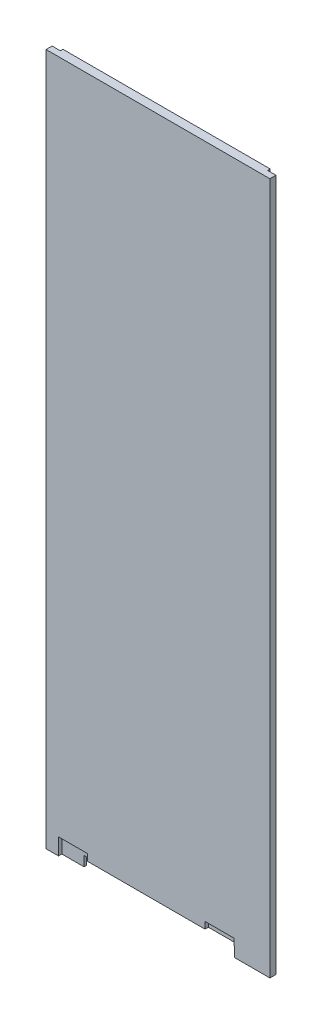
ISO-10303-21;
HEADER;
FILE_DESCRIPTION(('STEP AP214'),'2;1');
FILE_NAME('part.step','',(''),(''),'','','');
FILE_SCHEMA(('AUTOMOTIVE_DESIGN { 1 0 10303 214 1 1 1 1 }'));
ENDSEC;
DATA;
#1=APPLICATION_CONTEXT('core data for automotive mechanical design processes');
#2=APPLICATION_PROTOCOL_DEFINITION('international standard','automotive_design',2000,#1);
#3=PRODUCT_CONTEXT('',#1,'mechanical');
#4=PRODUCT('Part','Part','',(#3));
#5=PRODUCT_RELATED_PRODUCT_CATEGORY('part','',(#4));
#6=PRODUCT_DEFINITION_FORMATION('','',#4);
#7=PRODUCT_DEFINITION_CONTEXT('part definition',#1,'design');
#8=PRODUCT_DEFINITION('design','',#6,#7);
#9=PRODUCT_DEFINITION_SHAPE('','',#8);
#10=(LENGTH_UNIT() NAMED_UNIT(*) SI_UNIT(.MILLI.,.METRE.));
#11=(NAMED_UNIT(*) PLANE_ANGLE_UNIT() SI_UNIT($,.RADIAN.));
#12=(NAMED_UNIT(*) SI_UNIT($,.STERADIAN.) SOLID_ANGLE_UNIT());
#13=UNCERTAINTY_MEASURE_WITH_UNIT(LENGTH_MEASURE(1.E-05),#10,'distance_accuracy_value','');
#14=(GEOMETRIC_REPRESENTATION_CONTEXT(3) GLOBAL_UNCERTAINTY_ASSIGNED_CONTEXT((#13)) GLOBAL_UNIT_ASSIGNED_CONTEXT((#10,
#11,#12)) REPRESENTATION_CONTEXT('',''));
#15=CARTESIAN_POINT('',(0.,0.,0.));
#16=DIRECTION('',(0.,0.,1.));
#17=DIRECTION('',(1.,0.,0.));
#18=AXIS2_PLACEMENT_3D('',#15,#16,#17);
#19=CARTESIAN_POINT('',(54.,-167.,2.921));
#20=DIRECTION('',(0.,1.,0.));
#21=DIRECTION('',(0.,0.,1.));
#22=AXIS2_PLACEMENT_3D('',#19,#20,#21);
#23=PLANE('',#22);
#24=DIRECTION('',(1.,0.,0.));
#25=VECTOR('',#24,1.);
#26=CARTESIAN_POINT('',(-48.,-167.,1.31280493339982));
#27=LINE('',#26,#25);
#28=CARTESIAN_POINT('',(-48.,-167.,1.31280493339982));
#29=VERTEX_POINT('',#28);
#30=CARTESIAN_POINT('',(-37.32,-167.,1.31280493339982));
#31=VERTEX_POINT('',#30);
#32=EDGE_CURVE('E230',#29,#31,#27,.T.);
#33=ORIENTED_EDGE('',*,*,#32,.F.);
#34=DIRECTION('',(0.,0.,-1.));
#35=VECTOR('',#34,1.);
#36=CARTESIAN_POINT('',(-48.,-167.,2.921));
#37=LINE('',#36,#35);
#38=CARTESIAN_POINT('',(-48.,-167.,2.921));
#39=VERTEX_POINT('',#38);
#40=EDGE_CURVE('E240',#39,#29,#37,.T.);
#41=ORIENTED_EDGE('',*,*,#40,.F.);
#42=DIRECTION('',(1.,0.,0.));
#43=VECTOR('',#42,1.);
#44=CARTESIAN_POINT('',(54.,-167.,2.921));
#45=LINE('',#44,#43);
#46=CARTESIAN_POINT('',(-54.,-167.,2.921));
#47=VERTEX_POINT('',#46);
#48=EDGE_CURVE('E285',#47,#39,#45,.T.);
#49=ORIENTED_EDGE('',*,*,#48,.F.);
#50=DIRECTION('',(0.,0.,-1.));
#51=VECTOR('',#50,1.);
#52=CARTESIAN_POINT('',(-54.,-167.,2.921));
#53=LINE('',#52,#51);
#54=CARTESIAN_POINT('',(-54.,-167.,0.));
#55=VERTEX_POINT('',#54);
#56=EDGE_CURVE('E311',#47,#55,#53,.T.);
#57=ORIENTED_EDGE('',*,*,#56,.T.);
#58=DIRECTION('',(1.,0.,0.));
#59=VECTOR('',#58,1.);
#60=CARTESIAN_POINT('',(54.,-167.,0.));
#61=LINE('',#60,#59);
#62=CARTESIAN_POINT('',(-37.32,-167.,0.));
#63=VERTEX_POINT('',#62);
#64=EDGE_CURVE('E296',#55,#63,#61,.T.);
#65=ORIENTED_EDGE('',*,*,#64,.T.);
#66=DIRECTION('',(0.,0.,1.));
#67=VECTOR('',#66,1.);
#68=CARTESIAN_POINT('',(-37.32,-167.,0.));
#69=LINE('',#68,#67);
#70=EDGE_CURVE('E264',#63,#31,#69,.T.);
#71=ORIENTED_EDGE('',*,*,#70,.T.);
#72=EDGE_LOOP('',(#33,#41,#49,#57,#65,#71));
#73=FACE_BOUND('',#72,.T.);
#74=ADVANCED_FACE('F33',(#73),#23,.F.);
#75=CARTESIAN_POINT('',(-54.,167.,2.921));
#76=DIRECTION('',(1.,0.,0.));
#77=DIRECTION('',(0.,1.,0.));
#78=AXIS2_PLACEMENT_3D('',#75,#76,#77);
#79=PLANE('',#78);
#80=DIRECTION('',(0.,-1.,0.));
#81=VECTOR('',#80,1.);
#82=CARTESIAN_POINT('',(-54.,167.,0.));
#83=LINE('',#82,#81);
#84=CARTESIAN_POINT('',(-54.,167.,0.));
#85=VERTEX_POINT('',#84);
#86=EDGE_CURVE('E273',#85,#55,#83,.T.);
#87=ORIENTED_EDGE('',*,*,#86,.T.);
#88=ORIENTED_EDGE('',*,*,#56,.F.);
#89=DIRECTION('',(0.,-1.,0.));
#90=VECTOR('',#89,1.);
#91=CARTESIAN_POINT('',(-54.,167.,2.921));
#92=LINE('',#91,#90);
#93=CARTESIAN_POINT('',(-54.,167.,2.921));
#94=VERTEX_POINT('',#93);
#95=EDGE_CURVE('E280',#94,#47,#92,.T.);
#96=ORIENTED_EDGE('',*,*,#95,.F.);
#97=DIRECTION('',(0.,0.,-1.));
#98=VECTOR('',#97,1.);
#99=CARTESIAN_POINT('',(-54.,167.,2.921));
#100=LINE('',#99,#98);
#101=EDGE_CURVE('E292',#94,#85,#100,.T.);
#102=ORIENTED_EDGE('',*,*,#101,.T.);
#103=EDGE_LOOP('',(#87,#88,#96,#102));
#104=FACE_BOUND('',#103,.T.);
#105=ADVANCED_FACE('F35',(#104),#79,.F.);
#106=CARTESIAN_POINT('',(36.88,-167.,2.921));
#107=VERTEX_POINT('',#106);
#108=CARTESIAN_POINT('',(54.,-167.,2.921));
#109=VERTEX_POINT('',#108);
#110=EDGE_CURVE('E283',#107,#109,#45,.T.);
#111=ORIENTED_EDGE('',*,*,#110,.F.);
#112=DIRECTION('',(0.,0.,1.));
#113=VECTOR('',#112,1.);
#114=CARTESIAN_POINT('',(36.88,-167.,0.));
#115=LINE('',#114,#113);
#116=CARTESIAN_POINT('',(36.88,-167.,0.));
#117=VERTEX_POINT('',#116);
#118=EDGE_CURVE('E276',#117,#107,#115,.T.);
#119=ORIENTED_EDGE('',*,*,#118,.F.);
#120=CARTESIAN_POINT('',(54.,-167.,0.));
#121=VERTEX_POINT('',#120);
#122=EDGE_CURVE('E295',#117,#121,#61,.T.);
#123=ORIENTED_EDGE('',*,*,#122,.T.);
#124=DIRECTION('',(0.,0.,-1.));
#125=VECTOR('',#124,1.);
#126=CARTESIAN_POINT('',(54.,-167.,2.921));
#127=LINE('',#126,#125);
#128=EDGE_CURVE('E308',#109,#121,#127,.T.);
#129=ORIENTED_EDGE('',*,*,#128,.F.);
#130=EDGE_LOOP('',(#111,#119,#123,#129));
#131=FACE_BOUND('',#130,.T.);
#132=ADVANCED_FACE('F369',(#131),#23,.F.);
#133=CARTESIAN_POINT('',(54.,167.,2.921));
#134=DIRECTION('',(-1.,0.,0.));
#135=DIRECTION('',(0.,-1.,0.));
#136=AXIS2_PLACEMENT_3D('',#133,#134,#135);
#137=PLANE('',#136);
#138=DIRECTION('',(0.,1.,0.));
#139=VECTOR('',#138,1.);
#140=CARTESIAN_POINT('',(54.,167.,0.));
#141=LINE('',#140,#139);
#142=CARTESIAN_POINT('',(54.,167.,0.));
#143=VERTEX_POINT('',#142);
#144=EDGE_CURVE('E299',#121,#143,#141,.T.);
#145=ORIENTED_EDGE('',*,*,#144,.T.);
#146=DIRECTION('',(0.,0.,-1.));
#147=VECTOR('',#146,1.);
#148=CARTESIAN_POINT('',(54.,167.,2.921));
#149=LINE('',#148,#147);
#150=CARTESIAN_POINT('',(54.,167.,2.921));
#151=VERTEX_POINT('',#150);
#152=EDGE_CURVE('E305',#151,#143,#149,.T.);
#153=ORIENTED_EDGE('',*,*,#152,.F.);
#154=DIRECTION('',(0.,1.,0.));
#155=VECTOR('',#154,1.);
#156=CARTESIAN_POINT('',(54.,167.,2.921));
#157=LINE('',#156,#155);
#158=EDGE_CURVE('E288',#109,#151,#157,.T.);
#159=ORIENTED_EDGE('',*,*,#158,.F.);
#160=ORIENTED_EDGE('',*,*,#128,.T.);
#161=EDGE_LOOP('',(#145,#153,#159,#160));
#162=FACE_BOUND('',#161,.T.);
#163=ADVANCED_FACE('F372',(#162),#137,.F.);
#164=CARTESIAN_POINT('',(54.,167.,2.921));
#165=DIRECTION('',(0.,-1.,0.));
#166=DIRECTION('',(0.,0.,-1.));
#167=AXIS2_PLACEMENT_3D('',#164,#165,#166);
#168=PLANE('',#167);
#169=DIRECTION('',(-1.,0.,0.));
#170=VECTOR('',#169,1.);
#171=CARTESIAN_POINT('',(54.,167.,0.));
#172=LINE('',#171,#170);
#173=CARTESIAN_POINT('',(50.,167.,0.));
#174=VERTEX_POINT('',#173);
#175=EDGE_CURVE('E284',#143,#174,#172,.T.);
#176=ORIENTED_EDGE('',*,*,#175,.T.);
#177=DIRECTION('',(0.,0.,-1.));
#178=VECTOR('',#177,1.);
#179=CARTESIAN_POINT('',(50.,167.,0.));
#180=LINE('',#179,#178);
#181=CARTESIAN_POINT('',(50.,167.,-1.25));
#182=VERTEX_POINT('',#181);
#183=EDGE_CURVE('E48',#174,#182,#180,.T.);
#184=ORIENTED_EDGE('',*,*,#183,.T.);
#185=DIRECTION('',(-1.,0.,0.));
#186=VECTOR('',#185,1.);
#187=CARTESIAN_POINT('',(-50.,167.,-1.25));
#188=LINE('',#187,#186);
#189=CARTESIAN_POINT('',(-50.,167.,-1.25));
#190=VERTEX_POINT('',#189);
#191=EDGE_CURVE('E188',#182,#190,#188,.T.);
#192=ORIENTED_EDGE('',*,*,#191,.T.);
#193=DIRECTION('',(0.,0.,1.));
#194=VECTOR('',#193,1.);
#195=CARTESIAN_POINT('',(-50.,167.,0.));
#196=LINE('',#195,#194);
#197=CARTESIAN_POINT('',(-50.,167.,0.));
#198=VERTEX_POINT('',#197);
#199=EDGE_CURVE('E563',#190,#198,#196,.T.);
#200=ORIENTED_EDGE('',*,*,#199,.T.);
#201=EDGE_CURVE('E193',#198,#85,#172,.T.);
#202=ORIENTED_EDGE('',*,*,#201,.T.);
#203=ORIENTED_EDGE('',*,*,#101,.F.);
#204=DIRECTION('',(-1.,0.,0.));
#205=VECTOR('',#204,1.);
#206=CARTESIAN_POINT('',(54.,167.,2.921));
#207=LINE('',#206,#205);
#208=EDGE_CURVE('E290',#151,#94,#207,.T.);
#209=ORIENTED_EDGE('',*,*,#208,.F.);
#210=ORIENTED_EDGE('',*,*,#152,.T.);
#211=EDGE_LOOP('',(#176,#184,#192,#200,#202,#203,#209,#210));
#212=FACE_BOUND('',#211,.T.);
#213=ADVANCED_FACE('F379',(#212),#168,.F.);
#214=CARTESIAN_POINT('',(0.,0.,2.921));
#215=DIRECTION('',(0.,0.,-1.));
#216=DIRECTION('',(-1.,0.,0.));
#217=AXIS2_PLACEMENT_3D('',#214,#215,#216);
#218=PLANE('',#217);
#219=DIRECTION('',(-1.,0.,0.));
#220=VECTOR('',#219,1.);
#221=CARTESIAN_POINT('',(36.6829971722449,-159.,2.921));
#222=LINE('',#221,#220);
#223=CARTESIAN_POINT('',(36.6829971722449,-159.,2.921));
#224=VERTEX_POINT('',#223);
#225=CARTESIAN_POINT('',(22.6829971722449,-159.,2.921));
#226=VERTEX_POINT('',#225);
#227=EDGE_CURVE('E205',#224,#226,#222,.T.);
#228=ORIENTED_EDGE('',*,*,#227,.F.);
#229=DIRECTION('',(0.,-1.,0.));
#230=VECTOR('',#229,1.);
#231=CARTESIAN_POINT('',(36.6829971722449,-159.,2.921));
#232=LINE('',#231,#230);
#233=CARTESIAN_POINT('',(36.6829971722449,-162.24924483,2.921));
#234=VERTEX_POINT('',#233);
#235=EDGE_CURVE('E215',#224,#234,#232,.T.);
#236=ORIENTED_EDGE('',*,*,#235,.T.);
#237=DIRECTION('',(-1.,0.,0.));
#238=VECTOR('',#237,1.);
#239=CARTESIAN_POINT('',(-37.32,-162.24924483,2.921));
#240=LINE('',#239,#238);
#241=CARTESIAN_POINT('',(36.88,-162.24924483,2.921));
#242=VERTEX_POINT('',#241);
#243=EDGE_CURVE('E258',#242,#234,#240,.T.);
#244=ORIENTED_EDGE('',*,*,#243,.F.);
#245=DIRECTION('',(0.,1.,0.));
#246=VECTOR('',#245,1.);
#247=CARTESIAN_POINT('',(36.88,-167.,2.921));
#248=LINE('',#247,#246);
#249=EDGE_CURVE('E253',#107,#242,#248,.T.);
#250=ORIENTED_EDGE('',*,*,#249,.F.);
#251=ORIENTED_EDGE('',*,*,#110,.T.);
#252=ORIENTED_EDGE('',*,*,#158,.T.);
#253=ORIENTED_EDGE('',*,*,#208,.T.);
#254=ORIENTED_EDGE('',*,*,#95,.T.);
#255=ORIENTED_EDGE('',*,*,#48,.T.);
#256=DIRECTION('',(0.,-1.,0.));
#257=VECTOR('',#256,1.);
#258=CARTESIAN_POINT('',(-48.,-159.,2.921));
#259=LINE('',#258,#257);
#260=CARTESIAN_POINT('',(-48.,-159.,2.921));
#261=VERTEX_POINT('',#260);
#262=EDGE_CURVE('E206',#261,#39,#259,.T.);
#263=ORIENTED_EDGE('',*,*,#262,.F.);
#264=DIRECTION('',(-1.,0.,0.));
#265=VECTOR('',#264,1.);
#266=CARTESIAN_POINT('',(-48.,-159.,2.921));
#267=LINE('',#266,#265);
#268=CARTESIAN_POINT('',(-34.,-159.,2.921));
#269=VERTEX_POINT('',#268);
#270=EDGE_CURVE('E236',#269,#261,#267,.T.);
#271=ORIENTED_EDGE('',*,*,#270,.F.);
#272=DIRECTION('',(0.,-1.,0.));
#273=VECTOR('',#272,1.);
#274=CARTESIAN_POINT('',(-34.,-159.,2.921));
#275=LINE('',#274,#273);
#276=CARTESIAN_POINT('',(-34.,-162.24924483,2.921));
#277=VERTEX_POINT('',#276);
#278=EDGE_CURVE('E245',#269,#277,#275,.T.);
#279=ORIENTED_EDGE('',*,*,#278,.T.);
#280=CARTESIAN_POINT('',(22.6829971722449,-162.24924483,2.921));
#281=VERTEX_POINT('',#280);
#282=EDGE_CURVE('E267',#281,#277,#240,.T.);
#283=ORIENTED_EDGE('',*,*,#282,.F.);
#284=DIRECTION('',(0.,-1.,0.));
#285=VECTOR('',#284,1.);
#286=CARTESIAN_POINT('',(22.6829971722449,-159.,2.921));
#287=LINE('',#286,#285);
#288=EDGE_CURVE('E222',#226,#281,#287,.T.);
#289=ORIENTED_EDGE('',*,*,#288,.F.);
#290=EDGE_LOOP('',(#228,#236,#244,#250,#251,#252,#253,#254,#255,#263,#271,#279,#283,#289));
#291=FACE_BOUND('',#290,.T.);
#292=ADVANCED_FACE('F339',(#291),#218,.F.);
#293=CARTESIAN_POINT('',(0.,0.,0.));
#294=DIRECTION('',(0.,0.,-1.));
#295=DIRECTION('',(-1.,0.,0.));
#296=AXIS2_PLACEMENT_3D('',#293,#294,#295);
#297=PLANE('',#296);
#298=DIRECTION('',(0.,1.,0.));
#299=VECTOR('',#298,1.);
#300=CARTESIAN_POINT('',(-50.,165.,0.));
#301=LINE('',#300,#299);
#302=CARTESIAN_POINT('',(-50.,165.,0.));
#303=VERTEX_POINT('',#302);
#304=EDGE_CURVE('E185',#303,#198,#301,.T.);
#305=ORIENTED_EDGE('',*,*,#304,.F.);
#306=DIRECTION('',(1.,0.,0.));
#307=VECTOR('',#306,1.);
#308=CARTESIAN_POINT('',(-50.,165.,0.));
#309=LINE('',#308,#307);
#310=CARTESIAN_POINT('',(50.,165.,0.));
#311=VERTEX_POINT('',#310);
#312=EDGE_CURVE('E171',#303,#311,#309,.T.);
#313=ORIENTED_EDGE('',*,*,#312,.T.);
#314=DIRECTION('',(0.,1.,0.));
#315=VECTOR('',#314,1.);
#316=CARTESIAN_POINT('',(50.,165.,0.));
#317=LINE('',#316,#315);
#318=EDGE_CURVE('E194',#311,#174,#317,.T.);
#319=ORIENTED_EDGE('',*,*,#318,.T.);
#320=ORIENTED_EDGE('',*,*,#175,.F.);
#321=ORIENTED_EDGE('',*,*,#144,.F.);
#322=ORIENTED_EDGE('',*,*,#122,.F.);
#323=DIRECTION('',(0.,1.,0.));
#324=VECTOR('',#323,1.);
#325=CARTESIAN_POINT('',(36.88,-167.,0.));
#326=LINE('',#325,#324);
#327=CARTESIAN_POINT('',(36.88,-162.24924483,0.));
#328=VERTEX_POINT('',#327);
#329=EDGE_CURVE('E257',#117,#328,#326,.T.);
#330=ORIENTED_EDGE('',*,*,#329,.T.);
#331=DIRECTION('',(-1.,0.,0.));
#332=VECTOR('',#331,1.);
#333=CARTESIAN_POINT('',(-37.32,-162.24924483,0.));
#334=LINE('',#333,#332);
#335=CARTESIAN_POINT('',(-37.32,-162.24924483,0.));
#336=VERTEX_POINT('',#335);
#337=EDGE_CURVE('E261',#328,#336,#334,.T.);
#338=ORIENTED_EDGE('',*,*,#337,.T.);
#339=DIRECTION('',(0.,-1.,0.));
#340=VECTOR('',#339,1.);
#341=CARTESIAN_POINT('',(-37.32,-167.,0.));
#342=LINE('',#341,#340);
#343=EDGE_CURVE('E254',#336,#63,#342,.T.);
#344=ORIENTED_EDGE('',*,*,#343,.T.);
#345=ORIENTED_EDGE('',*,*,#64,.F.);
#346=ORIENTED_EDGE('',*,*,#86,.F.);
#347=ORIENTED_EDGE('',*,*,#201,.F.);
#348=EDGE_LOOP('',(#305,#313,#319,#320,#321,#322,#330,#338,#344,#345,#346,#347));
#349=FACE_BOUND('',#348,.T.);
#350=ADVANCED_FACE('F191',(#349),#297,.T.);
#351=CARTESIAN_POINT('',(-37.32,-167.,0.));
#352=DIRECTION('',(-1.,0.,0.));
#353=DIRECTION('',(0.,-1.,0.));
#354=AXIS2_PLACEMENT_3D('',#351,#352,#353);
#355=PLANE('',#354);
#356=DIRECTION('',(0.,0.,1.));
#357=VECTOR('',#356,1.);
#358=CARTESIAN_POINT('',(-37.32,-162.24924483,0.));
#359=LINE('',#358,#357);
#360=CARTESIAN_POINT('',(-37.32,-162.24924483,1.31280493339982));
#361=VERTEX_POINT('',#360);
#362=EDGE_CURVE('E270',#336,#361,#359,.T.);
#363=ORIENTED_EDGE('',*,*,#362,.T.);
#364=DIRECTION('',(0.,-1.,0.));
#365=VECTOR('',#364,1.);
#366=CARTESIAN_POINT('',(-37.32,-167.,1.31280493339982));
#367=LINE('',#366,#365);
#368=EDGE_CURVE('E56',#361,#31,#367,.T.);
#369=ORIENTED_EDGE('',*,*,#368,.T.);
#370=ORIENTED_EDGE('',*,*,#70,.F.);
#371=ORIENTED_EDGE('',*,*,#343,.F.);
#372=EDGE_LOOP('',(#363,#369,#370,#371));
#373=FACE_BOUND('',#372,.T.);
#374=ADVANCED_FACE('F355',(#373),#355,.F.);
#375=CARTESIAN_POINT('',(-37.32,-162.24924483,0.));
#376=DIRECTION('',(0.,1.,0.));
#377=DIRECTION('',(0.,0.,1.));
#378=AXIS2_PLACEMENT_3D('',#375,#376,#377);
#379=PLANE('',#378);
#380=ORIENTED_EDGE('',*,*,#243,.T.);
#381=DIRECTION('',(0.,0.,-1.));
#382=VECTOR('',#381,1.);
#383=CARTESIAN_POINT('',(36.6829971722449,-162.24924483,0.));
#384=LINE('',#383,#382);
#385=CARTESIAN_POINT('',(36.6829971722449,-162.24924483,1.31280493339983));
#386=VERTEX_POINT('',#385);
#387=EDGE_CURVE('E11',#234,#386,#384,.T.);
#388=ORIENTED_EDGE('',*,*,#387,.T.);
#389=DIRECTION('',(-1.,0.,0.));
#390=VECTOR('',#389,1.);
#391=CARTESIAN_POINT('',(-37.32,-162.24924483,1.31280493339982));
#392=LINE('',#391,#390);
#393=CARTESIAN_POINT('',(22.6829971722449,-162.24924483,1.31280493339983));
#394=VERTEX_POINT('',#393);
#395=EDGE_CURVE('E41',#386,#394,#392,.T.);
#396=ORIENTED_EDGE('',*,*,#395,.T.);
#397=DIRECTION('',(0.,0.,1.));
#398=VECTOR('',#397,1.);
#399=CARTESIAN_POINT('',(22.6829971722449,-162.24924483,0.));
#400=LINE('',#399,#398);
#401=EDGE_CURVE('E319',#394,#281,#400,.T.);
#402=ORIENTED_EDGE('',*,*,#401,.T.);
#403=ORIENTED_EDGE('',*,*,#282,.T.);
#404=DIRECTION('',(0.,0.,-1.));
#405=VECTOR('',#404,1.);
#406=CARTESIAN_POINT('',(-34.,-162.24924483,0.));
#407=LINE('',#406,#405);
#408=CARTESIAN_POINT('',(-34.,-162.24924483,1.31280493339982));
#409=VERTEX_POINT('',#408);
#410=EDGE_CURVE('E316',#277,#409,#407,.T.);
#411=ORIENTED_EDGE('',*,*,#410,.T.);
#412=DIRECTION('',(-1.,0.,0.));
#413=VECTOR('',#412,1.);
#414=CARTESIAN_POINT('',(-37.32,-162.24924483,1.31280493339982));
#415=LINE('',#414,#413);
#416=EDGE_CURVE('E314',#409,#361,#415,.T.);
#417=ORIENTED_EDGE('',*,*,#416,.T.);
#418=ORIENTED_EDGE('',*,*,#362,.F.);
#419=ORIENTED_EDGE('',*,*,#337,.F.);
#420=DIRECTION('',(0.,0.,1.));
#421=VECTOR('',#420,1.);
#422=CARTESIAN_POINT('',(36.88,-162.24924483,0.));
#423=LINE('',#422,#421);
#424=EDGE_CURVE('E274',#328,#242,#423,.T.);
#425=ORIENTED_EDGE('',*,*,#424,.T.);
#426=EDGE_LOOP('',(#380,#388,#396,#402,#403,#411,#417,#418,#419,#425));
#427=FACE_BOUND('',#426,.T.);
#428=ADVANCED_FACE('F323',(#427),#379,.F.);
#429=CARTESIAN_POINT('',(36.88,-167.,0.));
#430=DIRECTION('',(1.,0.,0.));
#431=DIRECTION('',(0.,0.,-1.));
#432=AXIS2_PLACEMENT_3D('',#429,#430,#431);
#433=PLANE('',#432);
#434=ORIENTED_EDGE('',*,*,#249,.T.);
#435=ORIENTED_EDGE('',*,*,#424,.F.);
#436=ORIENTED_EDGE('',*,*,#329,.F.);
#437=ORIENTED_EDGE('',*,*,#118,.T.);
#438=EDGE_LOOP('',(#434,#435,#436,#437));
#439=FACE_BOUND('',#438,.T.);
#440=ADVANCED_FACE('F359',(#439),#433,.F.);
#441=CARTESIAN_POINT('',(-34.,-159.,2.921));
#442=DIRECTION('',(1.,0.,0.));
#443=DIRECTION('',(0.,0.,-1.));
#444=AXIS2_PLACEMENT_3D('',#441,#442,#443);
#445=PLANE('',#444);
#446=ORIENTED_EDGE('',*,*,#278,.F.);
#447=DIRECTION('',(0.,0.,1.));
#448=VECTOR('',#447,1.);
#449=CARTESIAN_POINT('',(-34.,-159.,2.921));
#450=LINE('',#449,#448);
#451=CARTESIAN_POINT('',(-34.,-159.,1.31280493339982));
#452=VERTEX_POINT('',#451);
#453=EDGE_CURVE('E233',#452,#269,#450,.T.);
#454=ORIENTED_EDGE('',*,*,#453,.F.);
#455=DIRECTION('',(0.,-1.,0.));
#456=VECTOR('',#455,1.);
#457=CARTESIAN_POINT('',(-34.,-159.,1.31280493339982));
#458=LINE('',#457,#456);
#459=EDGE_CURVE('E248',#452,#409,#458,.T.);
#460=ORIENTED_EDGE('',*,*,#459,.T.);
#461=ORIENTED_EDGE('',*,*,#410,.F.);
#462=EDGE_LOOP('',(#446,#454,#460,#461));
#463=FACE_BOUND('',#462,.T.);
#464=ADVANCED_FACE('F342',(#463),#445,.F.);
#465=CARTESIAN_POINT('',(-48.,-159.,1.31280493339982));
#466=DIRECTION('',(0.,0.,-1.));
#467=DIRECTION('',(-1.,0.,0.));
#468=AXIS2_PLACEMENT_3D('',#465,#466,#467);
#469=PLANE('',#468);
#470=ORIENTED_EDGE('',*,*,#416,.F.);
#471=ORIENTED_EDGE('',*,*,#459,.F.);
#472=DIRECTION('',(1.,0.,0.));
#473=VECTOR('',#472,1.);
#474=CARTESIAN_POINT('',(-48.,-159.,1.31280493339982));
#475=LINE('',#474,#473);
#476=CARTESIAN_POINT('',(-48.,-159.,1.31280493339982));
#477=VERTEX_POINT('',#476);
#478=EDGE_CURVE('E229',#477,#452,#475,.T.);
#479=ORIENTED_EDGE('',*,*,#478,.F.);
#480=DIRECTION('',(0.,-1.,0.));
#481=VECTOR('',#480,1.);
#482=CARTESIAN_POINT('',(-48.,-159.,1.31280493339982));
#483=LINE('',#482,#481);
#484=EDGE_CURVE('E239',#477,#29,#483,.T.);
#485=ORIENTED_EDGE('',*,*,#484,.T.);
#486=ORIENTED_EDGE('',*,*,#32,.T.);
#487=ORIENTED_EDGE('',*,*,#368,.F.);
#488=EDGE_LOOP('',(#470,#471,#479,#485,#486,#487));
#489=FACE_BOUND('',#488,.T.);
#490=ADVANCED_FACE('F345',(#489),#469,.F.);
#491=CARTESIAN_POINT('',(-48.,-159.,2.921));
#492=DIRECTION('',(-1.,0.,0.));
#493=DIRECTION('',(0.,0.,1.));
#494=AXIS2_PLACEMENT_3D('',#491,#492,#493);
#495=PLANE('',#494);
#496=ORIENTED_EDGE('',*,*,#40,.T.);
#497=ORIENTED_EDGE('',*,*,#484,.F.);
#498=DIRECTION('',(0.,0.,-1.));
#499=VECTOR('',#498,1.);
#500=CARTESIAN_POINT('',(-48.,-159.,2.921));
#501=LINE('',#500,#499);
#502=EDGE_CURVE('E226',#261,#477,#501,.T.);
#503=ORIENTED_EDGE('',*,*,#502,.F.);
#504=ORIENTED_EDGE('',*,*,#262,.T.);
#505=EDGE_LOOP('',(#496,#497,#503,#504));
#506=FACE_BOUND('',#505,.T.);
#507=ADVANCED_FACE('F350',(#506),#495,.F.);
#508=CARTESIAN_POINT('',(0.,-159.,0.));
#509=DIRECTION('',(0.,-1.,0.));
#510=DIRECTION('',(0.,0.,-1.));
#511=AXIS2_PLACEMENT_3D('',#508,#509,#510);
#512=PLANE('',#511);
#513=ORIENTED_EDGE('',*,*,#502,.T.);
#514=ORIENTED_EDGE('',*,*,#478,.T.);
#515=ORIENTED_EDGE('',*,*,#453,.T.);
#516=ORIENTED_EDGE('',*,*,#270,.T.);
#517=EDGE_LOOP('',(#513,#514,#515,#516));
#518=FACE_BOUND('',#517,.T.);
#519=ADVANCED_FACE('F347',(#518),#512,.T.);
#520=CARTESIAN_POINT('',(36.6829971722449,-159.,2.921));
#521=DIRECTION('',(1.,0.,0.));
#522=DIRECTION('',(0.,0.,-1.));
#523=AXIS2_PLACEMENT_3D('',#520,#521,#522);
#524=PLANE('',#523);
#525=ORIENTED_EDGE('',*,*,#235,.F.);
#526=DIRECTION('',(0.,0.,1.));
#527=VECTOR('',#526,1.);
#528=CARTESIAN_POINT('',(36.6829971722449,-159.,2.921));
#529=LINE('',#528,#527);
#530=CARTESIAN_POINT('',(36.6829971722449,-159.,1.31280493339983));
#531=VERTEX_POINT('',#530);
#532=EDGE_CURVE('E202',#531,#224,#529,.T.);
#533=ORIENTED_EDGE('',*,*,#532,.F.);
#534=DIRECTION('',(0.,-1.,0.));
#535=VECTOR('',#534,1.);
#536=CARTESIAN_POINT('',(36.6829971722449,-159.,1.31280493339983));
#537=LINE('',#536,#535);
#538=EDGE_CURVE('E216',#531,#386,#537,.T.);
#539=ORIENTED_EDGE('',*,*,#538,.T.);
#540=ORIENTED_EDGE('',*,*,#387,.F.);
#541=EDGE_LOOP('',(#525,#533,#539,#540));
#542=FACE_BOUND('',#541,.T.);
#543=ADVANCED_FACE('F331',(#542),#524,.F.);
#544=CARTESIAN_POINT('',(36.6829971722449,-159.,1.31280493339983));
#545=DIRECTION('',(0.,0.,-1.));
#546=DIRECTION('',(-1.,0.,0.));
#547=AXIS2_PLACEMENT_3D('',#544,#545,#546);
#548=PLANE('',#547);
#549=ORIENTED_EDGE('',*,*,#538,.F.);
#550=DIRECTION('',(1.,0.,0.));
#551=VECTOR('',#550,1.);
#552=CARTESIAN_POINT('',(36.6829971722449,-159.,1.31280493339983));
#553=LINE('',#552,#551);
#554=CARTESIAN_POINT('',(22.6829971722449,-159.,1.31280493339983));
#555=VERTEX_POINT('',#554);
#556=EDGE_CURVE('E212',#555,#531,#553,.T.);
#557=ORIENTED_EDGE('',*,*,#556,.F.);
#558=DIRECTION('',(0.,-1.,0.));
#559=VECTOR('',#558,1.);
#560=CARTESIAN_POINT('',(22.6829971722449,-159.,1.31280493339983));
#561=LINE('',#560,#559);
#562=EDGE_CURVE('E219',#555,#394,#561,.T.);
#563=ORIENTED_EDGE('',*,*,#562,.T.);
#564=ORIENTED_EDGE('',*,*,#395,.F.);
#565=EDGE_LOOP('',(#549,#557,#563,#564));
#566=FACE_BOUND('',#565,.T.);
#567=ADVANCED_FACE('F327',(#566),#548,.F.);
#568=CARTESIAN_POINT('',(22.6829971722449,-159.,2.921));
#569=DIRECTION('',(-1.,0.,0.));
#570=DIRECTION('',(0.,0.,1.));
#571=AXIS2_PLACEMENT_3D('',#568,#569,#570);
#572=PLANE('',#571);
#573=ORIENTED_EDGE('',*,*,#562,.F.);
#574=DIRECTION('',(0.,0.,-1.));
#575=VECTOR('',#574,1.);
#576=CARTESIAN_POINT('',(22.6829971722449,-159.,2.921));
#577=LINE('',#576,#575);
#578=EDGE_CURVE('E209',#226,#555,#577,.T.);
#579=ORIENTED_EDGE('',*,*,#578,.F.);
#580=ORIENTED_EDGE('',*,*,#288,.T.);
#581=ORIENTED_EDGE('',*,*,#401,.F.);
#582=EDGE_LOOP('',(#573,#579,#580,#581));
#583=FACE_BOUND('',#582,.T.);
#584=ADVANCED_FACE('F337',(#583),#572,.F.);
#585=CARTESIAN_POINT('',(0.,-159.,0.));
#586=DIRECTION('',(0.,1.,0.));
#587=DIRECTION('',(0.,0.,1.));
#588=AXIS2_PLACEMENT_3D('',#585,#586,#587);
#589=PLANE('',#588);
#590=ORIENTED_EDGE('',*,*,#532,.T.);
#591=ORIENTED_EDGE('',*,*,#227,.T.);
#592=ORIENTED_EDGE('',*,*,#578,.T.);
#593=ORIENTED_EDGE('',*,*,#556,.T.);
#594=EDGE_LOOP('',(#590,#591,#592,#593));
#595=FACE_BOUND('',#594,.T.);
#596=ADVANCED_FACE('F334',(#595),#589,.F.);
#597=CARTESIAN_POINT('',(-50.,165.,0.));
#598=DIRECTION('',(-1.,0.,0.));
#599=DIRECTION('',(0.,0.,1.));
#600=AXIS2_PLACEMENT_3D('',#597,#598,#599);
#601=PLANE('',#600);
#602=ORIENTED_EDGE('',*,*,#199,.F.);
#603=DIRECTION('',(0.,1.,0.));
#604=VECTOR('',#603,1.);
#605=CARTESIAN_POINT('',(-50.,165.,-1.25));
#606=LINE('',#605,#604);
#607=CARTESIAN_POINT('',(-50.,165.,-1.25));
#608=VERTEX_POINT('',#607);
#609=EDGE_CURVE('E187',#608,#190,#606,.T.);
#610=ORIENTED_EDGE('',*,*,#609,.F.);
#611=DIRECTION('',(0.,0.,1.));
#612=VECTOR('',#611,1.);
#613=CARTESIAN_POINT('',(-50.,165.,0.));
#614=LINE('',#613,#612);
#615=EDGE_CURVE('E175',#608,#303,#614,.T.);
#616=ORIENTED_EDGE('',*,*,#615,.T.);
#617=ORIENTED_EDGE('',*,*,#304,.T.);
#618=EDGE_LOOP('',(#602,#610,#616,#617));
#619=FACE_BOUND('',#618,.T.);
#620=ADVANCED_FACE('F184',(#619),#601,.T.);
#621=CARTESIAN_POINT('',(-50.,165.,-1.25));
#622=DIRECTION('',(0.,0.,-1.));
#623=DIRECTION('',(-1.,0.,0.));
#624=AXIS2_PLACEMENT_3D('',#621,#622,#623);
#625=PLANE('',#624);
#626=ORIENTED_EDGE('',*,*,#191,.F.);
#627=DIRECTION('',(0.,1.,0.));
#628=VECTOR('',#627,1.);
#629=CARTESIAN_POINT('',(50.,165.,-1.25));
#630=LINE('',#629,#628);
#631=CARTESIAN_POINT('',(50.,165.,-1.25));
#632=VERTEX_POINT('',#631);
#633=EDGE_CURVE('E197',#632,#182,#630,.T.);
#634=ORIENTED_EDGE('',*,*,#633,.F.);
#635=DIRECTION('',(-1.,0.,0.));
#636=VECTOR('',#635,1.);
#637=CARTESIAN_POINT('',(-50.,165.,-1.25));
#638=LINE('',#637,#636);
#639=EDGE_CURVE('E195',#632,#608,#638,.T.);
#640=ORIENTED_EDGE('',*,*,#639,.T.);
#641=ORIENTED_EDGE('',*,*,#609,.T.);
#642=EDGE_LOOP('',(#626,#634,#640,#641));
#643=FACE_BOUND('',#642,.T.);
#644=ADVANCED_FACE('F421',(#643),#625,.T.);
#645=CARTESIAN_POINT('',(50.,165.,0.));
#646=DIRECTION('',(1.,0.,0.));
#647=DIRECTION('',(0.,0.,-1.));
#648=AXIS2_PLACEMENT_3D('',#645,#646,#647);
#649=PLANE('',#648);
#650=ORIENTED_EDGE('',*,*,#183,.F.);
#651=ORIENTED_EDGE('',*,*,#318,.F.);
#652=DIRECTION('',(0.,0.,-1.));
#653=VECTOR('',#652,1.);
#654=CARTESIAN_POINT('',(50.,165.,0.));
#655=LINE('',#654,#653);
#656=EDGE_CURVE('E178',#311,#632,#655,.T.);
#657=ORIENTED_EDGE('',*,*,#656,.T.);
#658=ORIENTED_EDGE('',*,*,#633,.T.);
#659=EDGE_LOOP('',(#650,#651,#657,#658));
#660=FACE_BOUND('',#659,.T.);
#661=ADVANCED_FACE('F422',(#660),#649,.T.);
#662=CARTESIAN_POINT('',(0.,165.,0.));
#663=DIRECTION('',(0.,-1.,0.));
#664=DIRECTION('',(0.,0.,-1.));
#665=AXIS2_PLACEMENT_3D('',#662,#663,#664);
#666=PLANE('',#665);
#667=ORIENTED_EDGE('',*,*,#615,.F.);
#668=ORIENTED_EDGE('',*,*,#639,.F.);
#669=ORIENTED_EDGE('',*,*,#656,.F.);
#670=ORIENTED_EDGE('',*,*,#312,.F.);
#671=EDGE_LOOP('',(#667,#668,#669,#670));
#672=FACE_BOUND('',#671,.T.);
#673=ADVANCED_FACE('F173',(#672),#666,.T.);
#674=CLOSED_SHELL('',(#74,#105,#132,#163,#213,#292,#350,#374,#428,#440,#464,#490,#507,#519,#543,
#567,#584,#596,#620,#644,#661,#673));
#675=MANIFOLD_SOLID_BREP('B2',#674);
#676=ADVANCED_BREP_SHAPE_REPRESENTATION('',(#18,#675),#14);
#677=SHAPE_DEFINITION_REPRESENTATION(#9,#676);
ENDSEC;
END-ISO-10303-21;
